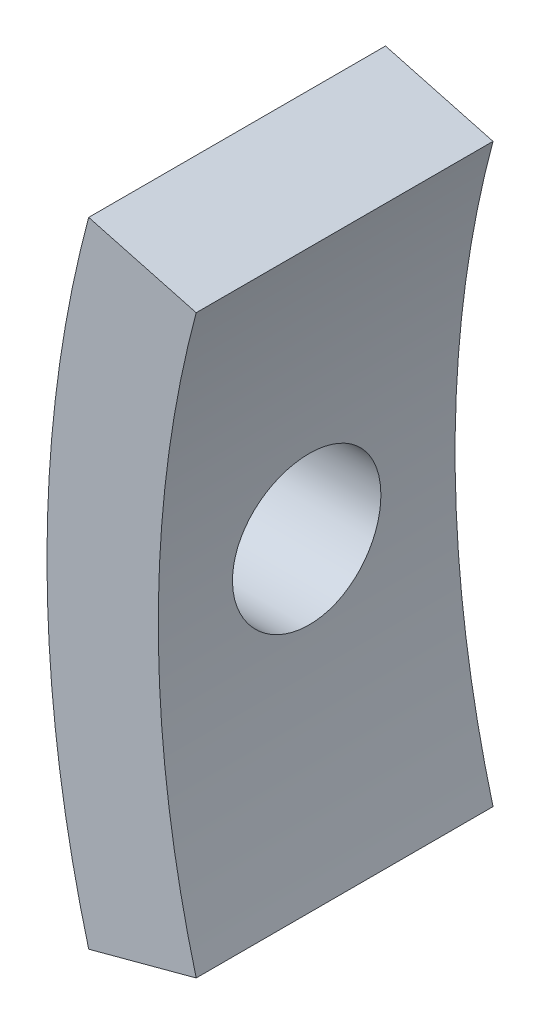
ISO-10303-21;
HEADER;
FILE_DESCRIPTION(('STEP AP214'),'2;1');
FILE_NAME('part.step','',(''),(''),'','','');
FILE_SCHEMA(('AUTOMOTIVE_DESIGN { 1 0 10303 214 1 1 1 1 }'));
ENDSEC;
DATA;
#1=APPLICATION_CONTEXT('core data for automotive mechanical design processes');
#2=APPLICATION_PROTOCOL_DEFINITION('international standard','automotive_design',2000,#1);
#3=PRODUCT_CONTEXT('',#1,'mechanical');
#4=PRODUCT('Part','Part','',(#3));
#5=PRODUCT_RELATED_PRODUCT_CATEGORY('part','',(#4));
#6=PRODUCT_DEFINITION_FORMATION('','',#4);
#7=PRODUCT_DEFINITION_CONTEXT('part definition',#1,'design');
#8=PRODUCT_DEFINITION('design','',#6,#7);
#9=PRODUCT_DEFINITION_SHAPE('','',#8);
#10=(LENGTH_UNIT() NAMED_UNIT(*) SI_UNIT(.MILLI.,.METRE.));
#11=(NAMED_UNIT(*) PLANE_ANGLE_UNIT() SI_UNIT($,.RADIAN.));
#12=(NAMED_UNIT(*) SI_UNIT($,.STERADIAN.) SOLID_ANGLE_UNIT());
#13=UNCERTAINTY_MEASURE_WITH_UNIT(LENGTH_MEASURE(1.E-05),#10,'distance_accuracy_value','');
#14=(GEOMETRIC_REPRESENTATION_CONTEXT(3) GLOBAL_UNCERTAINTY_ASSIGNED_CONTEXT((#13)) GLOBAL_UNIT_ASSIGNED_CONTEXT((#10,
#11,#12)) REPRESENTATION_CONTEXT('',''));
#15=CARTESIAN_POINT('',(0.,0.,0.));
#16=DIRECTION('',(0.,0.,1.));
#17=DIRECTION('',(1.,0.,0.));
#18=AXIS2_PLACEMENT_3D('',#15,#16,#17);
#19=CARTESIAN_POINT('',(0.,0.,10.));
#20=DIRECTION('',(0.,0.,-1.));
#21=DIRECTION('',(-1.,0.,0.));
#22=AXIS2_PLACEMENT_3D('',#19,#20,#21);
#23=CYLINDRICAL_SURFACE('',#22,41.25);
#24=CARTESIAN_POINT('',(-41.25,0.,2.5));
#25=CARTESIAN_POINT('',(-41.2499989918191,0.140287939997213,2.5000061758564));
#26=CARTESIAN_POINT('',(-41.2492766825129,0.280674317576282,2.51184810011563));
#27=CARTESIAN_POINT('',(-41.2464646890099,0.557571287222174,2.55891824933256));
#28=CARTESIAN_POINT('',(-41.2443734101053,0.694077165164272,2.59417374937768));
#29=CARTESIAN_POINT('',(-41.2390600767209,0.959162147921766,2.687055246647));
#30=CARTESIAN_POINT('',(-41.2358386154685,1.08774536975491,2.74466950954622));
#31=CARTESIAN_POINT('',(-41.2286273228044,1.3333819515172,2.88061421466808));
#32=CARTESIAN_POINT('',(-41.2246376683167,1.45043795693551,2.9589398883568));
#33=CARTESIAN_POINT('',(-41.216332181883,1.66989699803438,3.1342059043982));
#34=CARTESIAN_POINT('',(-41.2120159490692,1.77228156391604,3.23116935657653));
#35=CARTESIAN_POINT('',(-41.2035471978479,1.9593335290282,3.44091105332249));
#36=CARTESIAN_POINT('',(-41.1993946862615,2.04400019071227,3.55368995591652));
#37=CARTESIAN_POINT('',(-41.191718600841,2.19326913605893,3.79196480221191));
#38=CARTESIAN_POINT('',(-41.188195505232,2.25785619074504,3.9174703029435));
#39=CARTESIAN_POINT('',(-41.1821807021913,2.36503505506553,4.17756866611208));
#40=CARTESIAN_POINT('',(-41.1796889842103,2.40762708967099,4.31216143558609));
#41=CARTESIAN_POINT('',(-41.1760217213673,2.46955592464277,4.58643678695995));
#42=CARTESIAN_POINT('',(-41.1748445480694,2.48892149976337,4.72611284966319));
#43=CARTESIAN_POINT('',(-41.1739342458213,2.50393651829069,5.00673773229334));
#44=CARTESIAN_POINT('',(-41.1742011013392,2.49958621678335,5.14768653851444));
#45=CARTESIAN_POINT('',(-41.176147251374,2.46731686290339,5.42665989917554));
#46=CARTESIAN_POINT('',(-41.1778246803012,2.43942894062856,5.56468806931219));
#47=CARTESIAN_POINT('',(-41.182399998768,2.36092425901567,5.83410039170284));
#48=CARTESIAN_POINT('',(-41.1852978952639,2.31030737012881,5.9654845060828));
#49=CARTESIAN_POINT('',(-41.1919897147656,2.18774620793145,6.21797925999937));
#50=CARTESIAN_POINT('',(-41.1957842312121,2.1157878013503,6.3390830228702));
#51=CARTESIAN_POINT('',(-41.2038410669682,1.95259648947066,6.56750419622555));
#52=CARTESIAN_POINT('',(-41.2081033912124,1.86136338084502,6.6748214612583));
#53=CARTESIAN_POINT('',(-41.2166237805698,1.662037051427,6.87280442716057));
#54=CARTESIAN_POINT('',(-41.2208818277387,1.55391688669524,6.96344300426276));
#55=CARTESIAN_POINT('',(-41.2289071900758,1.3239800759103,7.1252865138915));
#56=CARTESIAN_POINT('',(-41.232674505082,1.20216342533311,7.19649143999899));
#57=CARTESIAN_POINT('',(-41.2392941487778,0.948275217139378,7.31744405411007));
#58=CARTESIAN_POINT('',(-41.2421464342302,0.816203175297722,7.36719072819927));
#59=CARTESIAN_POINT('',(-41.2466140100446,0.545560522871049,7.44379665801998));
#60=CARTESIAN_POINT('',(-41.2482293139926,0.406989983678879,7.47065616512904));
#61=CARTESIAN_POINT('',(-41.2500391526377,0.127519203816319,7.50069173838673));
#62=CARTESIAN_POINT('',(-41.2502359371739,-0.0133769922879677,7.50390530828203));
#63=CARTESIAN_POINT('',(-41.2491925441782,-0.293706466023889,7.48665575733301));
#64=CARTESIAN_POINT('',(-41.2479523736716,-0.433139750804299,7.4661927522429));
#65=CARTESIAN_POINT('',(-41.2441761427799,-0.706479843201855,7.40220197203401));
#66=CARTESIAN_POINT('',(-41.2416410484329,-0.840390690293452,7.35869138995415));
#67=CARTESIAN_POINT('',(-41.2355602114038,-1.09900930689565,7.24985801858106));
#68=CARTESIAN_POINT('',(-41.2320144601707,-1.22371699852798,7.18453504473445));
#69=CARTESIAN_POINT('',(-41.2243051946021,-1.46056112891647,7.03383560819996));
#70=CARTESIAN_POINT('',(-41.2201409105929,-1.57268159505947,6.94843408239109));
#71=CARTESIAN_POINT('',(-41.2116658589312,-1.78100782480282,6.76003828168418));
#72=CARTESIAN_POINT('',(-41.2073550899205,-1.87721344078234,6.65704384361817));
#73=CARTESIAN_POINT('',(-41.1990664242435,-2.05110595855139,6.4362241256121));
#74=CARTESIAN_POINT('',(-41.1950889691178,-2.12876854044975,6.31837967525981));
#75=CARTESIAN_POINT('',(-41.1879224855199,-2.2632041015157,6.07130154034839));
#76=CARTESIAN_POINT('',(-41.1847334524215,-2.31997720325903,5.94206792262436));
#77=CARTESIAN_POINT('',(-41.1795066237874,-2.41098006238399,5.67596896202273));
#78=CARTESIAN_POINT('',(-41.1774680450301,-2.44522515931911,5.53910888110216));
#79=CARTESIAN_POINT('',(-41.174769840323,-2.49025002619076,5.26156876516036));
#80=CARTESIAN_POINT('',(-41.1741102016609,-2.50103001244644,5.12088876536616));
#81=CARTESIAN_POINT('',(-41.1742445725533,-2.49881658346988,4.8399440599383));
#82=CARTESIAN_POINT('',(-41.1750362440043,-2.48586140630583,4.69967905032315));
#83=CARTESIAN_POINT('',(-41.1779790690382,-2.43662464008969,4.42331973927751));
#84=CARTESIAN_POINT('',(-41.1801302251078,-2.40034300837016,4.28722544547635));
#85=CARTESIAN_POINT('',(-41.1855490318234,-2.30549172570862,4.02306468133989));
#86=CARTESIAN_POINT('',(-41.1888166775944,-2.2469221720824,3.8949981759557));
#87=CARTESIAN_POINT('',(-41.196100155311,-2.10916305078099,3.65051174845564));
#88=CARTESIAN_POINT('',(-41.2001159672847,-2.02997403350885,3.53409151557626));
#89=CARTESIAN_POINT('',(-41.2084507462492,-1.85308303181996,3.3160088234576));
#90=CARTESIAN_POINT('',(-41.2127701578697,-1.755353523131,3.21436870743972));
#91=CARTESIAN_POINT('',(-41.2212216757742,-1.54419043920837,3.02890271036658));
#92=CARTESIAN_POINT('',(-41.2253537359307,-1.43075302412902,2.94508119786379));
#93=CARTESIAN_POINT('',(-41.2329689859681,-1.19127174474746,2.79757383615063));
#94=CARTESIAN_POINT('',(-41.2364513974954,-1.06521303291799,2.73391207777956));
#95=CARTESIAN_POINT('',(-41.2423643305275,-0.804267181596409,2.62873481889494));
#96=CARTESIAN_POINT('',(-41.2447960850827,-0.669390606048128,2.58719334464275));
#97=CARTESIAN_POINT('',(-41.2476954651421,-0.444738939167492,2.53824929745727));
#98=CARTESIAN_POINT('',(-41.2485558321101,-0.35641648491876,2.52392431919488));
#99=CARTESIAN_POINT('',(-41.2497084203778,-0.178742675516026,2.50479770899517));
#100=CARTESIAN_POINT('',(-41.2500006424118,-0.0893913216917964,2.49999606475107));
#101=CARTESIAN_POINT('',(-41.25,0.,2.5));
#102=B_SPLINE_CURVE_WITH_KNOTS('',3,(#24,#25,#26,#27,#28,#29,#30,#31,#32,#33,#34,#35,#36,#37,
#38,#39,#40,#41,#42,#43,#44,#45,#46,#47,#48,#49,#50,#51,#52,#53,#54,#55,#56,#57,#58,#59,#60,#61,
#62,#63,#64,#65,#66,#67,#68,#69,#70,#71,#72,#73,#74,#75,#76,#77,#78,#79,#80,#81,#82,#83,#84,#85,
#86,#87,#88,#89,#90,#91,#92,#93,#94,#95,#96,#97,#98,#99,#100,#101),.UNSPECIFIED.,.T.,.F.,(4,2,2,
2,2,2,2,2,2,2,2,2,2,2,2,2,2,2,2,2,2,2,2,2,2,2,2,2,2,2,2,2,2,2,2,2,2,2,4),(0.,0.420537491878218,
0.841565740241308,1.26237332275032,1.68308410399817,2.10431994855725,2.52557332449153,
2.94714541658273,3.36871319663387,3.78975816428727,4.21079860322589,4.63128305868323,
5.05176991081572,5.47253585158768,5.8933062312045,6.3147549564725,6.73620382094723,
7.15767259693533,7.57913674372864,7.99993228100835,8.42072576103733,8.84120577856951,
9.26168935384907,9.68270061229154,10.1037157756748,10.5252801199953,10.9468419906123,
11.3681165174239,11.7893871605914,12.209979720674,12.630573050083,13.0511645430759,
13.4717448102134,13.8929544057997,14.3142671497296,14.7360814775188,15.1573994106611,
15.4253657861068,15.6933318152658),.UNSPECIFIED.);
#103=CARTESIAN_POINT('',(-41.25,0.,2.5));
#104=VERTEX_POINT('',#103);
#105=EDGE_CURVE('E127',#104,#104,#102,.T.);
#106=ORIENTED_EDGE('',*,*,#105,.T.);
#107=EDGE_LOOP('',(#106));
#108=FACE_BOUND('',#107,.T.);
#109=CARTESIAN_POINT('',(0.,0.,0.));
#110=DIRECTION('',(0.,0.,1.));
#111=DIRECTION('',(1.,0.,0.));
#112=AXIS2_PLACEMENT_3D('',#109,#110,#111);
#113=CIRCLE('',#112,41.25);
#114=CARTESIAN_POINT('',(-39.8444403344241,10.6762856104789,0.));
#115=VERTEX_POINT('',#114);
#116=CARTESIAN_POINT('',(-39.8444403344241,-10.6762856104789,0.));
#117=VERTEX_POINT('',#116);
#118=EDGE_CURVE('E123',#115,#117,#113,.T.);
#119=ORIENTED_EDGE('',*,*,#118,.T.);
#120=DIRECTION('',(0.,0.,-1.));
#121=VECTOR('',#120,1.);
#122=CARTESIAN_POINT('',(-39.8444403344241,-10.6762856104789,10.));
#123=LINE('',#122,#121);
#124=CARTESIAN_POINT('',(-39.8444403344241,-10.6762856104789,10.));
#125=VERTEX_POINT('',#124);
#126=EDGE_CURVE('E11',#125,#117,#123,.T.);
#127=ORIENTED_EDGE('',*,*,#126,.F.);
#128=CARTESIAN_POINT('',(0.,0.,10.));
#129=DIRECTION('',(0.,0.,1.));
#130=DIRECTION('',(1.,0.,0.));
#131=AXIS2_PLACEMENT_3D('',#128,#129,#130);
#132=CIRCLE('',#131,41.25);
#133=CARTESIAN_POINT('',(-39.8444403344241,10.6762856104789,10.));
#134=VERTEX_POINT('',#133);
#135=EDGE_CURVE('E92',#134,#125,#132,.T.);
#136=ORIENTED_EDGE('',*,*,#135,.F.);
#137=DIRECTION('',(0.,0.,-1.));
#138=VECTOR('',#137,1.);
#139=CARTESIAN_POINT('',(-39.8444403344241,10.6762856104789,10.));
#140=LINE('',#139,#138);
#141=EDGE_CURVE('E72',#134,#115,#140,.T.);
#142=ORIENTED_EDGE('',*,*,#141,.T.);
#143=EDGE_LOOP('',(#119,#127,#136,#142));
#144=FACE_BOUND('',#143,.T.);
#145=ADVANCED_FACE('F50',(#108,#144),#23,.T.);
#146=CARTESIAN_POINT('',(0.,0.,10.));
#147=DIRECTION('',(0.258819045102518,-0.965925826289069,0.));
#148=DIRECTION('',(0.965925826289069,0.258819045102518,0.));
#149=AXIS2_PLACEMENT_3D('',#146,#147,#148);
#150=PLANE('',#149);
#151=DIRECTION('',(-0.965925826289069,-0.258819045102518,0.));
#152=VECTOR('',#151,1.);
#153=CARTESIAN_POINT('',(0.,0.,0.));
#154=LINE('',#153,#152);
#155=CARTESIAN_POINT('',(-36.2222184858401,-9.70571419134443,0.));
#156=VERTEX_POINT('',#155);
#157=EDGE_CURVE('E102',#156,#117,#154,.T.);
#158=ORIENTED_EDGE('',*,*,#157,.F.);
#159=DIRECTION('',(0.,0.,-1.));
#160=VECTOR('',#159,1.);
#161=CARTESIAN_POINT('',(-36.2222184858401,-9.70571419134443,10.));
#162=LINE('',#161,#160);
#163=CARTESIAN_POINT('',(-36.2222184858401,-9.70571419134443,10.));
#164=VERTEX_POINT('',#163);
#165=EDGE_CURVE('E64',#164,#156,#162,.T.);
#166=ORIENTED_EDGE('',*,*,#165,.F.);
#167=DIRECTION('',(-0.965925826289069,-0.258819045102518,0.));
#168=VECTOR('',#167,1.);
#169=CARTESIAN_POINT('',(0.,0.,10.));
#170=LINE('',#169,#168);
#171=EDGE_CURVE('E105',#164,#125,#170,.T.);
#172=ORIENTED_EDGE('',*,*,#171,.T.);
#173=ORIENTED_EDGE('',*,*,#126,.T.);
#174=EDGE_LOOP('',(#158,#166,#172,#173));
#175=FACE_BOUND('',#174,.T.);
#176=ADVANCED_FACE('F101',(#175),#150,.T.);
#177=CARTESIAN_POINT('',(0.,0.,10.));
#178=DIRECTION('',(0.,0.,-1.));
#179=DIRECTION('',(-1.,0.,0.));
#180=AXIS2_PLACEMENT_3D('',#177,#178,#179);
#181=CYLINDRICAL_SURFACE('',#180,37.5);
#182=CARTESIAN_POINT('',(-37.5,0.,2.5));
#183=CARTESIAN_POINT('',(-37.4999988949616,0.140258977010312,2.50000616387059));
#184=CARTESIAN_POINT('',(-37.499204686013,0.280615680119362,2.51184321907331));
#185=CARTESIAN_POINT('',(-37.496112784275,0.557452133652319,2.55889289933641));
#186=CARTESIAN_POINT('',(-37.493813349856,0.693927201705201,2.59413260325069));
#187=CARTESIAN_POINT('',(-37.487971075263,0.95895041839924,2.68696968780272));
#188=CARTESIAN_POINT('',(-37.4844288995603,1.08750276008043,2.74455512232292));
#189=CARTESIAN_POINT('',(-37.4764993321387,1.33308366320747,2.88042929292802));
#190=CARTESIAN_POINT('',(-37.472112131779,1.45011482462133,2.95871334322105));
#191=CARTESIAN_POINT('',(-37.4629772438181,1.66956149864711,3.13390650145673));
#192=CARTESIAN_POINT('',(-37.4582290298196,1.77195501669647,3.23084313460885));
#193=CARTESIAN_POINT('',(-37.4489117445818,1.95903158594379,3.44053267948664));
#194=CARTESIAN_POINT('',(-37.4443426809009,2.04371389056526,3.55328625760558));
#195=CARTESIAN_POINT('',(-37.4358948341803,2.19303365081675,3.7915357283236));
#196=CARTESIAN_POINT('',(-37.4320166907645,2.25765257331595,3.91704326094832));
#197=CARTESIAN_POINT('',(-37.4253949317149,2.364892743479,4.17715643624195));
#198=CARTESIAN_POINT('',(-37.4226513024991,2.4075142544868,4.31176196997154));
#199=CARTESIAN_POINT('',(-37.4186130440881,2.46948799848222,4.58603611152447));
#200=CARTESIAN_POINT('',(-37.4173162474677,2.4888750410689,4.72569682150087));
#201=CARTESIAN_POINT('',(-37.4163114076107,2.50393699377009,5.00629574431535));
#202=CARTESIAN_POINT('',(-37.4166033442898,2.49961220364396,5.14723394098126));
#203=CARTESIAN_POINT('',(-37.4187410376214,2.46740211693187,5.42614969003823));
#204=CARTESIAN_POINT('',(-37.4205843081641,2.43955451686147,5.5641316174483));
#205=CARTESIAN_POINT('',(-37.4256130394562,2.36114778897838,5.83345822607119));
#206=CARTESIAN_POINT('',(-37.4287985091506,2.31058850980522,5.96480286304373));
#207=CARTESIAN_POINT('',(-37.4361555312242,2.18815092527691,6.217247436151));
#208=CARTESIAN_POINT('',(-37.4403278724689,2.11625555293595,6.3383390707436));
#209=CARTESIAN_POINT('',(-37.4491876808018,1.95319898230805,6.56674953127805));
#210=CARTESIAN_POINT('',(-37.4538751545047,1.86203753661862,6.67406818032767));
#211=CARTESIAN_POINT('',(-37.4632480434526,1.66282440208197,6.87210558681892));
#212=CARTESIAN_POINT('',(-37.4679334368246,1.55474009549578,6.96279153715494));
#213=CARTESIAN_POINT('',(-37.4767653919949,1.32486360414213,7.12473614263293));
#214=CARTESIAN_POINT('',(-37.4809119535796,1.20307141394195,7.19599479007541));
#215=CARTESIAN_POINT('',(-37.4881994048067,0.949216236834572,7.31705937183569));
#216=CARTESIAN_POINT('',(-37.4913402344478,0.817152637726992,7.36686402628595));
#217=CARTESIAN_POINT('',(-37.4962615235866,0.546512490200751,7.44358474892098));
#218=CARTESIAN_POINT('',(-37.4980420011561,0.407936028329261,7.47050112116949));
#219=CARTESIAN_POINT('',(-37.5000396335899,0.128488427811503,7.50064048564145));
#220=CARTESIAN_POINT('',(-37.5002597807663,-0.0123777991171104,7.50390882895183));
#221=CARTESIAN_POINT('',(-37.4991199107994,-0.292656429188998,7.48677790932016));
#222=CARTESIAN_POINT('',(-37.4977599030294,-0.432068840951224,7.46637878677139));
#223=CARTESIAN_POINT('',(-37.4936147234098,-0.705354401323426,7.40252954911302));
#224=CARTESIAN_POINT('',(-37.4908308404194,-0.839232441272394,7.35910027905598));
#225=CARTESIAN_POINT('',(-37.4841510218562,-1.09780002003548,7.25044473578553));
#226=CARTESIAN_POINT('',(-37.4802550749189,-1.22248946493213,7.18521823981837));
#227=CARTESIAN_POINT('',(-37.4717812471731,-1.45934782845821,7.03470460034779));
#228=CARTESIAN_POINT('',(-37.4672023420591,-1.57149749003374,6.94938721118287));
#229=CARTESIAN_POINT('',(-37.4578811933762,-1.77989881911622,6.76115759774009));
#230=CARTESIAN_POINT('',(-37.4531389479835,-1.87615030905113,6.65824517696353));
#231=CARTESIAN_POINT('',(-37.4440168968829,-2.05017703871124,6.43755094134983));
#232=CARTESIAN_POINT('',(-37.4396376760658,-2.12792282589155,6.31974587445686));
#233=CARTESIAN_POINT('',(-37.431744886098,-2.26252968526845,6.07272706107534));
#234=CARTESIAN_POINT('',(-37.4282313110149,-2.31939090059304,5.94351339278078));
#235=CARTESIAN_POINT('',(-37.4224702865581,-2.41056367931973,5.67745227175187));
#236=CARTESIAN_POINT('',(-37.4202218016279,-2.44489368978709,5.54061116371191));
#237=CARTESIAN_POINT('',(-37.4172416660747,-2.49008977050006,5.26309167111252));
#238=CARTESIAN_POINT('',(-37.4165099979196,-2.50095611195101,5.12241333092487));
#239=CARTESIAN_POINT('',(-37.4166464354321,-2.49891370883697,4.84150552590963));
#240=CARTESIAN_POINT('',(-37.4175114258553,-2.48605126159773,4.70127572060888));
#241=CARTESIAN_POINT('',(-37.4207371063492,-2.43701248565452,4.42497183133092));
#242=CARTESIAN_POINT('',(-37.4230977990664,-2.40083611570052,4.28889775470701));
#243=CARTESIAN_POINT('',(-37.4290480901341,-2.3062070944571,4.02476176434009));
#244=CARTESIAN_POINT('',(-37.4326376709138,-2.24775476167295,3.89669973607001));
#245=CARTESIAN_POINT('',(-37.4406412032888,-2.11023911843818,3.65220064520375));
#246=CARTESIAN_POINT('',(-37.4450551350305,-2.03117630435072,3.53576330274312));
#247=CARTESIAN_POINT('',(-37.454220073972,-1.85451193735908,3.3175834025011));
#248=CARTESIAN_POINT('',(-37.4589716838866,-1.7568766864575,3.21586815667025));
#249=CARTESIAN_POINT('',(-37.4682713033829,-1.54588856638677,3.03023497683197));
#250=CARTESIAN_POINT('',(-37.4728192629684,-1.43253186528326,2.94632139444059));
#251=CARTESIAN_POINT('',(-37.4812044363904,-1.19317399709723,2.79860295613541));
#252=CARTESIAN_POINT('',(-37.4850406855575,-1.06715601992628,2.73482531201537));
#253=CARTESIAN_POINT('',(-37.4915576090638,-0.806265538548386,2.6294124269209));
#254=CARTESIAN_POINT('',(-37.4942396316548,-0.671403578458621,2.58775133824106));
#255=CARTESIAN_POINT('',(-37.4974455944423,-0.446434684430285,2.53854377602949));
#256=CARTESIAN_POINT('',(-37.4983992211416,-0.357780710404946,2.52410864170624));
#257=CARTESIAN_POINT('',(-37.4996767769118,-0.179431157049143,2.50483478956849));
#258=CARTESIAN_POINT('',(-37.5000007069869,-0.0897355793801814,2.49999605644851));
#259=CARTESIAN_POINT('',(-37.5,0.,2.5));
#260=B_SPLINE_CURVE_WITH_KNOTS('',3,(#182,#183,#184,#185,#186,#187,#188,#189,#190,#191,#192,
#193,#194,#195,#196,#197,#198,#199,#200,#201,#202,#203,#204,#205,#206,#207,#208,#209,#210,#211,
#212,#213,#214,#215,#216,#217,#218,#219,#220,#221,#222,#223,#224,#225,#226,#227,#228,#229,#230,
#231,#232,#233,#234,#235,#236,#237,#238,#239,#240,#241,#242,#243,#244,#245,#246,#247,#248,#249,
#250,#251,#252,#253,#254,#255,#256,#257,#258,#259),.UNSPECIFIED.,.T.,.F.,(4,2,2,2,2,2,2,2,2,2,2,
2,2,2,2,2,2,2,2,2,2,2,2,2,2,2,2,2,2,2,2,2,2,2,2,2,2,2,4),(0.,0.420449335110729,
0.841386015461155,1.26209797070812,1.68271476580991,2.10395708321809,2.52521715357485,
2.94686520432914,3.36850820716952,3.78951871670978,4.21052390394733,4.63085568587033,
5.05119026910787,5.47186199327271,5.89253911976059,6.31403728936436,6.73553562601738,
7.15705910425353,7.57857698259352,7.99928627882408,8.41999307945792,8.84031973817459,
9.26065069249292,9.68161852205996,10.1025910532404,10.5242291645611,10.9458643862202,
11.3671539686836,11.7884386816358,12.2089022936415,12.6293666495883,13.0498249938944,
13.4702732132185,13.8914917024446,14.3128130401705,14.7347013400904,15.1560954859288,
15.4250930621672,15.6940902093758),.UNSPECIFIED.);
#261=CARTESIAN_POINT('',(-37.5,0.,2.5));
#262=VERTEX_POINT('',#261);
#263=EDGE_CURVE('E51',#262,#262,#260,.T.);
#264=ORIENTED_EDGE('',*,*,#263,.F.);
#265=EDGE_LOOP('',(#264));
#266=FACE_BOUND('',#265,.T.);
#267=CARTESIAN_POINT('',(0.,0.,0.));
#268=DIRECTION('',(0.,0.,1.));
#269=DIRECTION('',(1.,0.,0.));
#270=AXIS2_PLACEMENT_3D('',#267,#268,#269);
#271=CIRCLE('',#270,37.5);
#272=CARTESIAN_POINT('',(-36.2222184858401,9.70571419134443,0.));
#273=VERTEX_POINT('',#272);
#274=EDGE_CURVE('E129',#273,#156,#271,.T.);
#275=ORIENTED_EDGE('',*,*,#274,.F.);
#276=DIRECTION('',(0.,0.,-1.));
#277=VECTOR('',#276,1.);
#278=CARTESIAN_POINT('',(-36.2222184858401,9.70571419134443,10.));
#279=LINE('',#278,#277);
#280=CARTESIAN_POINT('',(-36.2222184858401,9.70571419134443,10.));
#281=VERTEX_POINT('',#280);
#282=EDGE_CURVE('E82',#281,#273,#279,.T.);
#283=ORIENTED_EDGE('',*,*,#282,.F.);
#284=CARTESIAN_POINT('',(0.,0.,10.));
#285=DIRECTION('',(0.,0.,1.));
#286=DIRECTION('',(1.,0.,0.));
#287=AXIS2_PLACEMENT_3D('',#284,#285,#286);
#288=CIRCLE('',#287,37.5);
#289=EDGE_CURVE('E115',#281,#164,#288,.T.);
#290=ORIENTED_EDGE('',*,*,#289,.T.);
#291=ORIENTED_EDGE('',*,*,#165,.T.);
#292=EDGE_LOOP('',(#275,#283,#290,#291));
#293=FACE_BOUND('',#292,.T.);
#294=ADVANCED_FACE('F113',(#266,#293),#181,.F.);
#295=CARTESIAN_POINT('',(0.,0.,10.));
#296=DIRECTION('',(0.258819045102518,0.965925826289069,0.));
#297=DIRECTION('',(-0.965925826289069,0.258819045102518,0.));
#298=AXIS2_PLACEMENT_3D('',#295,#296,#297);
#299=PLANE('',#298);
#300=DIRECTION('',(0.965925826289069,-0.258819045102518,0.));
#301=VECTOR('',#300,1.);
#302=CARTESIAN_POINT('',(0.,0.,0.));
#303=LINE('',#302,#301);
#304=EDGE_CURVE('E135',#115,#273,#303,.T.);
#305=ORIENTED_EDGE('',*,*,#304,.F.);
#306=ORIENTED_EDGE('',*,*,#141,.F.);
#307=DIRECTION('',(0.965925826289069,-0.258819045102518,0.));
#308=VECTOR('',#307,1.);
#309=CARTESIAN_POINT('',(0.,0.,10.));
#310=LINE('',#309,#308);
#311=EDGE_CURVE('E120',#134,#281,#310,.T.);
#312=ORIENTED_EDGE('',*,*,#311,.T.);
#313=ORIENTED_EDGE('',*,*,#282,.T.);
#314=EDGE_LOOP('',(#305,#306,#312,#313));
#315=FACE_BOUND('',#314,.T.);
#316=ADVANCED_FACE('F156',(#315),#299,.T.);
#317=CARTESIAN_POINT('',(0.,0.,10.));
#318=DIRECTION('',(0.,0.,1.));
#319=DIRECTION('',(1.,0.,0.));
#320=AXIS2_PLACEMENT_3D('',#317,#318,#319);
#321=PLANE('',#320);
#322=ORIENTED_EDGE('',*,*,#135,.T.);
#323=ORIENTED_EDGE('',*,*,#171,.F.);
#324=ORIENTED_EDGE('',*,*,#289,.F.);
#325=ORIENTED_EDGE('',*,*,#311,.F.);
#326=EDGE_LOOP('',(#322,#323,#324,#325));
#327=FACE_BOUND('',#326,.T.);
#328=ADVANCED_FACE('F112',(#327),#321,.T.);
#329=CARTESIAN_POINT('',(0.,0.,0.));
#330=DIRECTION('',(0.,0.,1.));
#331=DIRECTION('',(1.,0.,0.));
#332=AXIS2_PLACEMENT_3D('',#329,#330,#331);
#333=PLANE('',#332);
#334=ORIENTED_EDGE('',*,*,#118,.F.);
#335=ORIENTED_EDGE('',*,*,#304,.T.);
#336=ORIENTED_EDGE('',*,*,#274,.T.);
#337=ORIENTED_EDGE('',*,*,#157,.T.);
#338=EDGE_LOOP('',(#334,#335,#336,#337));
#339=FACE_BOUND('',#338,.T.);
#340=ADVANCED_FACE('F151',(#339),#333,.F.);
#341=CARTESIAN_POINT('',(-36.2222184858401,0.,5.));
#342=DIRECTION('',(1.,0.,0.));
#343=DIRECTION('',(0.,0.,-1.));
#344=AXIS2_PLACEMENT_3D('',#341,#342,#343);
#345=CYLINDRICAL_SURFACE('',#344,2.5);
#346=ORIENTED_EDGE('',*,*,#263,.T.);
#347=EDGE_LOOP('',(#346));
#348=FACE_BOUND('',#347,.T.);
#349=ORIENTED_EDGE('',*,*,#105,.F.);
#350=EDGE_LOOP('',(#349));
#351=FACE_BOUND('',#350,.T.);
#352=ADVANCED_FACE('F150',(#348,#351),#345,.F.);
#353=CLOSED_SHELL('',(#145,#176,#294,#316,#328,#340,#352));
#354=MANIFOLD_SOLID_BREP('B2',#353);
#355=ADVANCED_BREP_SHAPE_REPRESENTATION('',(#18,#354),#14);
#356=SHAPE_DEFINITION_REPRESENTATION(#9,#355);
ENDSEC;
END-ISO-10303-21;
